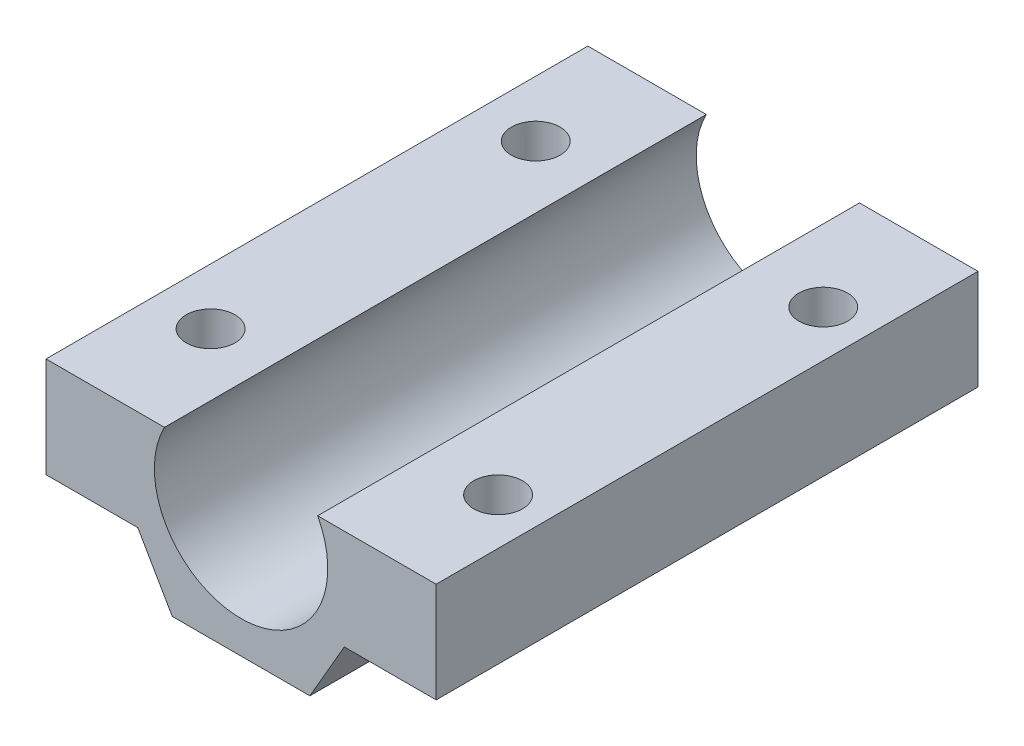
ISO-10303-21;
HEADER;
FILE_DESCRIPTION(('STEP AP214'),'2;1');
FILE_NAME('part.step','',(''),(''),'','','');
FILE_SCHEMA(('AUTOMOTIVE_DESIGN { 1 0 10303 214 1 1 1 1 }'));
ENDSEC;
DATA;
#1=APPLICATION_CONTEXT('core data for automotive mechanical design processes');
#2=APPLICATION_PROTOCOL_DEFINITION('international standard','automotive_design',2000,#1);
#3=PRODUCT_CONTEXT('',#1,'mechanical');
#4=PRODUCT('Part','Part','',(#3));
#5=PRODUCT_RELATED_PRODUCT_CATEGORY('part','',(#4));
#6=PRODUCT_DEFINITION_FORMATION('','',#4);
#7=PRODUCT_DEFINITION_CONTEXT('part definition',#1,'design');
#8=PRODUCT_DEFINITION('design','',#6,#7);
#9=PRODUCT_DEFINITION_SHAPE('','',#8);
#10=(LENGTH_UNIT() NAMED_UNIT(*) SI_UNIT(.MILLI.,.METRE.));
#11=(NAMED_UNIT(*) PLANE_ANGLE_UNIT() SI_UNIT($,.RADIAN.));
#12=(NAMED_UNIT(*) SI_UNIT($,.STERADIAN.) SOLID_ANGLE_UNIT());
#13=UNCERTAINTY_MEASURE_WITH_UNIT(LENGTH_MEASURE(1.E-05),#10,'distance_accuracy_value','');
#14=(GEOMETRIC_REPRESENTATION_CONTEXT(3) GLOBAL_UNCERTAINTY_ASSIGNED_CONTEXT((#13)) GLOBAL_UNIT_ASSIGNED_CONTEXT((#10,
#11,#12)) REPRESENTATION_CONTEXT('',''));
#15=CARTESIAN_POINT('',(0.,0.,0.));
#16=DIRECTION('',(0.,0.,1.));
#17=DIRECTION('',(1.,0.,0.));
#18=AXIS2_PLACEMENT_3D('',#15,#16,#17);
#19=CARTESIAN_POINT('',(0.,0.,50.));
#20=DIRECTION('',(0.,0.,1.));
#21=DIRECTION('',(1.,0.,0.));
#22=AXIS2_PLACEMENT_3D('',#19,#20,#21);
#23=PLANE('',#22);
#24=DIRECTION('',(0.,1.,0.));
#25=VECTOR('',#24,1.);
#26=CARTESIAN_POINT('',(18.,18.,50.));
#27=LINE('',#26,#25);
#28=CARTESIAN_POINT('',(18.,-5.5,50.));
#29=VERTEX_POINT('',#28);
#30=CARTESIAN_POINT('',(18.,3.75,50.));
#31=VERTEX_POINT('',#30);
#32=EDGE_CURVE('E134',#29,#31,#27,.T.);
#33=ORIENTED_EDGE('',*,*,#32,.T.);
#34=DIRECTION('',(1.,0.,0.));
#35=VECTOR('',#34,1.);
#36=CARTESIAN_POINT('',(-18.,3.75,50.));
#37=LINE('',#36,#35);
#38=CARTESIAN_POINT('',(7.06664701255128,3.75,50.));
#39=VERTEX_POINT('',#38);
#40=EDGE_CURVE('E117',#39,#31,#37,.T.);
#41=ORIENTED_EDGE('',*,*,#40,.F.);
#42=CARTESIAN_POINT('',(0.,0.,50.));
#43=DIRECTION('',(0.,0.,1.));
#44=DIRECTION('',(1.,0.,0.));
#45=AXIS2_PLACEMENT_3D('',#42,#43,#44);
#46=CIRCLE('',#45,8.);
#47=CARTESIAN_POINT('',(-7.06664701255129,3.75,50.));
#48=VERTEX_POINT('',#47);
#49=EDGE_CURVE('E127',#48,#39,#46,.T.);
#50=ORIENTED_EDGE('',*,*,#49,.F.);
#51=CARTESIAN_POINT('',(-18.,3.75,50.));
#52=VERTEX_POINT('',#51);
#53=EDGE_CURVE('E58',#52,#48,#37,.T.);
#54=ORIENTED_EDGE('',*,*,#53,.F.);
#55=DIRECTION('',(0.,-1.,0.));
#56=VECTOR('',#55,1.);
#57=CARTESIAN_POINT('',(-18.,18.,50.));
#58=LINE('',#57,#56);
#59=CARTESIAN_POINT('',(-18.,-5.5,50.));
#60=VERTEX_POINT('',#59);
#61=EDGE_CURVE('E123',#52,#60,#58,.T.);
#62=ORIENTED_EDGE('',*,*,#61,.T.);
#63=DIRECTION('',(-1.,0.,0.));
#64=VECTOR('',#63,1.);
#65=CARTESIAN_POINT('',(0.,-5.5,50.));
#66=LINE('',#65,#64);
#67=CARTESIAN_POINT('',(-9.52627944162882,-5.5,50.));
#68=VERTEX_POINT('',#67);
#69=EDGE_CURVE('E151',#68,#60,#66,.T.);
#70=ORIENTED_EDGE('',*,*,#69,.F.);
#71=DIRECTION('',(0.5,-0.866025403784439,0.));
#72=VECTOR('',#71,1.);
#73=CARTESIAN_POINT('',(-9.52627944162882,-5.5,50.));
#74=LINE('',#73,#72);
#75=CARTESIAN_POINT('',(-6.35085296108588,-11.,50.));
#76=VERTEX_POINT('',#75);
#77=EDGE_CURVE('E176',#68,#76,#74,.T.);
#78=ORIENTED_EDGE('',*,*,#77,.T.);
#79=DIRECTION('',(1.,0.,0.));
#80=VECTOR('',#79,1.);
#81=CARTESIAN_POINT('',(0.,-11.,50.));
#82=LINE('',#81,#80);
#83=CARTESIAN_POINT('',(6.35085296108588,-11.,50.));
#84=VERTEX_POINT('',#83);
#85=EDGE_CURVE('E173',#76,#84,#82,.T.);
#86=ORIENTED_EDGE('',*,*,#85,.T.);
#87=DIRECTION('',(0.5,0.866025403784439,0.));
#88=VECTOR('',#87,1.);
#89=CARTESIAN_POINT('',(9.52627944162882,-5.49999999999999,50.));
#90=LINE('',#89,#88);
#91=CARTESIAN_POINT('',(9.52627944162882,-5.5,50.));
#92=VERTEX_POINT('',#91);
#93=EDGE_CURVE('E169',#84,#92,#90,.T.);
#94=ORIENTED_EDGE('',*,*,#93,.T.);
#95=DIRECTION('',(-1.,0.,0.));
#96=VECTOR('',#95,1.);
#97=CARTESIAN_POINT('',(0.,-5.5,50.));
#98=LINE('',#97,#96);
#99=EDGE_CURVE('E166',#29,#92,#98,.T.);
#100=ORIENTED_EDGE('',*,*,#99,.F.);
#101=EDGE_LOOP('',(#33,#41,#50,#54,#62,#70,#78,#86,#94,#100));
#102=FACE_BOUND('',#101,.T.);
#103=ADVANCED_FACE('F33',(#102),#23,.T.);
#104=CARTESIAN_POINT('',(0.,0.,0.));
#105=DIRECTION('',(0.,0.,1.));
#106=DIRECTION('',(1.,0.,0.));
#107=AXIS2_PLACEMENT_3D('',#104,#105,#106);
#108=PLANE('',#107);
#109=DIRECTION('',(-1.,0.,0.));
#110=VECTOR('',#109,1.);
#111=CARTESIAN_POINT('',(0.,3.75,0.));
#112=LINE('',#111,#110);
#113=CARTESIAN_POINT('',(18.,3.75,0.));
#114=VERTEX_POINT('',#113);
#115=CARTESIAN_POINT('',(7.06664701255128,3.75,0.));
#116=VERTEX_POINT('',#115);
#117=EDGE_CURVE('E50',#114,#116,#112,.T.);
#118=ORIENTED_EDGE('',*,*,#117,.F.);
#119=DIRECTION('',(0.,1.,0.));
#120=VECTOR('',#119,1.);
#121=CARTESIAN_POINT('',(18.,18.,0.));
#122=LINE('',#121,#120);
#123=CARTESIAN_POINT('',(18.,-5.5,0.));
#124=VERTEX_POINT('',#123);
#125=EDGE_CURVE('E142',#124,#114,#122,.T.);
#126=ORIENTED_EDGE('',*,*,#125,.F.);
#127=DIRECTION('',(-1.,0.,0.));
#128=VECTOR('',#127,1.);
#129=CARTESIAN_POINT('',(0.,-5.5,0.));
#130=LINE('',#129,#128);
#131=CARTESIAN_POINT('',(9.52627944162882,-5.5,0.));
#132=VERTEX_POINT('',#131);
#133=EDGE_CURVE('E179',#124,#132,#130,.T.);
#134=ORIENTED_EDGE('',*,*,#133,.T.);
#135=DIRECTION('',(0.5,0.866025403784439,0.));
#136=VECTOR('',#135,1.);
#137=CARTESIAN_POINT('',(9.52627944162882,-5.49999999999999,0.));
#138=LINE('',#137,#136);
#139=CARTESIAN_POINT('',(6.35085296108588,-11.,0.));
#140=VERTEX_POINT('',#139);
#141=EDGE_CURVE('E211',#140,#132,#138,.T.);
#142=ORIENTED_EDGE('',*,*,#141,.F.);
#143=DIRECTION('',(1.,0.,0.));
#144=VECTOR('',#143,1.);
#145=CARTESIAN_POINT('',(0.,-11.,0.));
#146=LINE('',#145,#144);
#147=CARTESIAN_POINT('',(-6.35085296108588,-11.,0.));
#148=VERTEX_POINT('',#147);
#149=EDGE_CURVE('E162',#148,#140,#146,.T.);
#150=ORIENTED_EDGE('',*,*,#149,.F.);
#151=DIRECTION('',(0.5,-0.866025403784439,0.));
#152=VECTOR('',#151,1.);
#153=CARTESIAN_POINT('',(-9.52627944162882,-5.5,0.));
#154=LINE('',#153,#152);
#155=CARTESIAN_POINT('',(-9.52627944162882,-5.5,0.));
#156=VERTEX_POINT('',#155);
#157=EDGE_CURVE('E157',#156,#148,#154,.T.);
#158=ORIENTED_EDGE('',*,*,#157,.F.);
#159=DIRECTION('',(-1.,0.,0.));
#160=VECTOR('',#159,1.);
#161=CARTESIAN_POINT('',(0.,-5.5,0.));
#162=LINE('',#161,#160);
#163=CARTESIAN_POINT('',(-18.,-5.5,0.));
#164=VERTEX_POINT('',#163);
#165=EDGE_CURVE('E149',#156,#164,#162,.T.);
#166=ORIENTED_EDGE('',*,*,#165,.T.);
#167=DIRECTION('',(0.,-1.,0.));
#168=VECTOR('',#167,1.);
#169=CARTESIAN_POINT('',(-18.,18.,0.));
#170=LINE('',#169,#168);
#171=CARTESIAN_POINT('',(-18.,3.75,0.));
#172=VERTEX_POINT('',#171);
#173=EDGE_CURVE('E138',#172,#164,#170,.T.);
#174=ORIENTED_EDGE('',*,*,#173,.F.);
#175=CARTESIAN_POINT('',(-7.06664701255129,3.75,0.));
#176=VERTEX_POINT('',#175);
#177=EDGE_CURVE('E113',#176,#172,#112,.T.);
#178=ORIENTED_EDGE('',*,*,#177,.F.);
#179=CARTESIAN_POINT('',(0.,0.,0.));
#180=DIRECTION('',(0.,0.,1.));
#181=DIRECTION('',(1.,0.,0.));
#182=AXIS2_PLACEMENT_3D('',#179,#180,#181);
#183=CIRCLE('',#182,8.);
#184=EDGE_CURVE('E152',#176,#116,#183,.T.);
#185=ORIENTED_EDGE('',*,*,#184,.T.);
#186=EDGE_LOOP('',(#118,#126,#134,#142,#150,#158,#166,#174,#178,#185));
#187=FACE_BOUND('',#186,.T.);
#188=ADVANCED_FACE('F155',(#187),#108,.F.);
#189=CARTESIAN_POINT('',(18.,18.,50.));
#190=DIRECTION('',(-1.,0.,0.));
#191=DIRECTION('',(0.,-1.,0.));
#192=AXIS2_PLACEMENT_3D('',#189,#190,#191);
#193=PLANE('',#192);
#194=DIRECTION('',(0.,0.,-1.));
#195=VECTOR('',#194,1.);
#196=CARTESIAN_POINT('',(18.,3.75,50.));
#197=LINE('',#196,#195);
#198=EDGE_CURVE('E128',#31,#114,#197,.T.);
#199=ORIENTED_EDGE('',*,*,#198,.F.);
#200=ORIENTED_EDGE('',*,*,#32,.F.);
#201=DIRECTION('',(0.,0.,1.));
#202=VECTOR('',#201,1.);
#203=CARTESIAN_POINT('',(18.,-5.5,0.));
#204=LINE('',#203,#202);
#205=EDGE_CURVE('E158',#124,#29,#204,.T.);
#206=ORIENTED_EDGE('',*,*,#205,.F.);
#207=ORIENTED_EDGE('',*,*,#125,.T.);
#208=EDGE_LOOP('',(#199,#200,#206,#207));
#209=FACE_BOUND('',#208,.T.);
#210=ADVANCED_FACE('F35',(#209),#193,.F.);
#211=CARTESIAN_POINT('',(-18.,18.,50.));
#212=DIRECTION('',(1.,0.,0.));
#213=DIRECTION('',(0.,1.,0.));
#214=AXIS2_PLACEMENT_3D('',#211,#212,#213);
#215=PLANE('',#214);
#216=DIRECTION('',(0.,0.,-1.));
#217=VECTOR('',#216,1.);
#218=CARTESIAN_POINT('',(-18.,3.75,50.));
#219=LINE('',#218,#217);
#220=EDGE_CURVE('E110',#52,#172,#219,.T.);
#221=ORIENTED_EDGE('',*,*,#220,.T.);
#222=ORIENTED_EDGE('',*,*,#173,.T.);
#223=DIRECTION('',(0.,0.,1.));
#224=VECTOR('',#223,1.);
#225=CARTESIAN_POINT('',(-18.,-5.5,0.));
#226=LINE('',#225,#224);
#227=EDGE_CURVE('E133',#164,#60,#226,.T.);
#228=ORIENTED_EDGE('',*,*,#227,.T.);
#229=ORIENTED_EDGE('',*,*,#61,.F.);
#230=EDGE_LOOP('',(#221,#222,#228,#229));
#231=FACE_BOUND('',#230,.T.);
#232=ADVANCED_FACE('F131',(#231),#215,.F.);
#233=CARTESIAN_POINT('',(0.,0.,50.));
#234=DIRECTION('',(0.,0.,-1.));
#235=DIRECTION('',(-1.,0.,0.));
#236=AXIS2_PLACEMENT_3D('',#233,#234,#235);
#237=CYLINDRICAL_SURFACE('',#236,8.);
#238=ORIENTED_EDGE('',*,*,#49,.T.);
#239=DIRECTION('',(0.,0.,-1.));
#240=VECTOR('',#239,1.);
#241=CARTESIAN_POINT('',(7.06664701255128,3.75,50.));
#242=LINE('',#241,#240);
#243=EDGE_CURVE('E193',#39,#116,#242,.T.);
#244=ORIENTED_EDGE('',*,*,#243,.T.);
#245=ORIENTED_EDGE('',*,*,#184,.F.);
#246=DIRECTION('',(0.,0.,-1.));
#247=VECTOR('',#246,1.);
#248=CARTESIAN_POINT('',(-7.06664701255129,3.75,50.));
#249=LINE('',#248,#247);
#250=EDGE_CURVE('E192',#176,#48,#249,.F.);
#251=ORIENTED_EDGE('',*,*,#250,.T.);
#252=EDGE_LOOP('',(#238,#244,#245,#251));
#253=FACE_BOUND('',#252,.T.);
#254=ADVANCED_FACE('F191',(#253),#237,.F.);
#255=CARTESIAN_POINT('',(-12.8104985211385,-5.49999999999999,40.));
#256=DIRECTION('',(0.,-1.,0.));
#257=DIRECTION('',(0.,0.,-1.));
#258=AXIS2_PLACEMENT_3D('',#255,#256,#257);
#259=CYLINDRICAL_SURFACE('',#258,2.24999999999999);
#260=CARTESIAN_POINT('',(-12.8104985211385,-5.49999999999999,40.));
#261=DIRECTION('',(0.,-1.,0.));
#262=DIRECTION('',(0.,0.,-1.));
#263=AXIS2_PLACEMENT_3D('',#260,#261,#262);
#264=CIRCLE('',#263,2.24999999999999);
#265=CARTESIAN_POINT('',(-12.8104985211385,-5.49999999999999,37.75));
#266=VERTEX_POINT('',#265);
#267=EDGE_CURVE('E170',#266,#266,#264,.T.);
#268=ORIENTED_EDGE('',*,*,#267,.T.);
#269=EDGE_LOOP('',(#268));
#270=FACE_BOUND('',#269,.T.);
#271=CARTESIAN_POINT('',(-12.8104985211385,3.75,40.));
#272=DIRECTION('',(0.,1.,0.));
#273=DIRECTION('',(0.,0.,1.));
#274=AXIS2_PLACEMENT_3D('',#271,#272,#273);
#275=CIRCLE('',#274,2.24999999999999);
#276=CARTESIAN_POINT('',(-12.8104985211385,3.75,42.25));
#277=VERTEX_POINT('',#276);
#278=EDGE_CURVE('E11',#277,#277,#275,.F.);
#279=ORIENTED_EDGE('',*,*,#278,.F.);
#280=EDGE_LOOP('',(#279));
#281=FACE_BOUND('',#280,.T.);
#282=ADVANCED_FACE('F255',(#270,#281),#259,.F.);
#283=CARTESIAN_POINT('',(-12.8104985211385,-5.49999999999999,10.));
#284=DIRECTION('',(0.,-1.,0.));
#285=DIRECTION('',(0.,0.,-1.));
#286=AXIS2_PLACEMENT_3D('',#283,#284,#285);
#287=CYLINDRICAL_SURFACE('',#286,2.24999999999999);
#288=CARTESIAN_POINT('',(-12.8104985211385,-5.49999999999999,10.));
#289=DIRECTION('',(0.,-1.,0.));
#290=DIRECTION('',(0.,0.,-1.));
#291=AXIS2_PLACEMENT_3D('',#288,#289,#290);
#292=CIRCLE('',#291,2.24999999999999);
#293=CARTESIAN_POINT('',(-12.8104985211385,-5.49999999999999,7.75000000000001));
#294=VERTEX_POINT('',#293);
#295=EDGE_CURVE('E204',#294,#294,#292,.T.);
#296=ORIENTED_EDGE('',*,*,#295,.T.);
#297=EDGE_LOOP('',(#296));
#298=FACE_BOUND('',#297,.T.);
#299=CARTESIAN_POINT('',(-12.8104985211385,3.75,10.));
#300=DIRECTION('',(0.,1.,0.));
#301=DIRECTION('',(0.,0.,1.));
#302=AXIS2_PLACEMENT_3D('',#299,#300,#301);
#303=CIRCLE('',#302,2.24999999999999);
#304=CARTESIAN_POINT('',(-12.8104985211385,3.75,12.25));
#305=VERTEX_POINT('',#304);
#306=EDGE_CURVE('E42',#305,#305,#303,.F.);
#307=ORIENTED_EDGE('',*,*,#306,.F.);
#308=EDGE_LOOP('',(#307));
#309=FACE_BOUND('',#308,.T.);
#310=ADVANCED_FACE('F318',(#298,#309),#287,.F.);
#311=CARTESIAN_POINT('',(13.7183291249987,-5.5,10.));
#312=DIRECTION('',(0.,-1.,0.));
#313=DIRECTION('',(0.,0.,-1.));
#314=AXIS2_PLACEMENT_3D('',#311,#312,#313);
#315=CYLINDRICAL_SURFACE('',#314,2.24999999999999);
#316=CARTESIAN_POINT('',(13.7183291249987,-5.5,10.));
#317=DIRECTION('',(0.,-1.,0.));
#318=DIRECTION('',(0.,0.,-1.));
#319=AXIS2_PLACEMENT_3D('',#316,#317,#318);
#320=CIRCLE('',#319,2.24999999999999);
#321=CARTESIAN_POINT('',(13.7183291249987,-5.5,7.75000000000001));
#322=VERTEX_POINT('',#321);
#323=EDGE_CURVE('E201',#322,#322,#320,.T.);
#324=ORIENTED_EDGE('',*,*,#323,.T.);
#325=EDGE_LOOP('',(#324));
#326=FACE_BOUND('',#325,.T.);
#327=CARTESIAN_POINT('',(13.7183291249987,3.75,10.));
#328=DIRECTION('',(0.,1.,0.));
#329=DIRECTION('',(0.,0.,1.));
#330=AXIS2_PLACEMENT_3D('',#327,#328,#329);
#331=CIRCLE('',#330,2.24999999999999);
#332=CARTESIAN_POINT('',(13.7183291249987,3.75,12.25));
#333=VERTEX_POINT('',#332);
#334=EDGE_CURVE('E137',#333,#333,#331,.F.);
#335=ORIENTED_EDGE('',*,*,#334,.F.);
#336=EDGE_LOOP('',(#335));
#337=FACE_BOUND('',#336,.T.);
#338=ADVANCED_FACE('F310',(#326,#337),#315,.F.);
#339=CARTESIAN_POINT('',(13.7183291249987,-5.5,40.));
#340=DIRECTION('',(0.,-1.,0.));
#341=DIRECTION('',(0.,0.,-1.));
#342=AXIS2_PLACEMENT_3D('',#339,#340,#341);
#343=CYLINDRICAL_SURFACE('',#342,2.24999999999999);
#344=CARTESIAN_POINT('',(13.7183291249987,-5.5,40.));
#345=DIRECTION('',(0.,-1.,0.));
#346=DIRECTION('',(0.,0.,-1.));
#347=AXIS2_PLACEMENT_3D('',#344,#345,#346);
#348=CIRCLE('',#347,2.24999999999999);
#349=CARTESIAN_POINT('',(13.7183291249987,-5.5,37.75));
#350=VERTEX_POINT('',#349);
#351=EDGE_CURVE('E195',#350,#350,#348,.T.);
#352=ORIENTED_EDGE('',*,*,#351,.T.);
#353=EDGE_LOOP('',(#352));
#354=FACE_BOUND('',#353,.T.);
#355=CARTESIAN_POINT('',(13.7183291249987,3.75,40.));
#356=DIRECTION('',(0.,1.,0.));
#357=DIRECTION('',(0.,0.,1.));
#358=AXIS2_PLACEMENT_3D('',#355,#356,#357);
#359=CIRCLE('',#358,2.24999999999999);
#360=CARTESIAN_POINT('',(13.7183291249987,3.75,42.25));
#361=VERTEX_POINT('',#360);
#362=EDGE_CURVE('E37',#361,#361,#359,.F.);
#363=ORIENTED_EDGE('',*,*,#362,.F.);
#364=EDGE_LOOP('',(#363));
#365=FACE_BOUND('',#364,.T.);
#366=ADVANCED_FACE('F239',(#354,#365),#343,.F.);
#367=CARTESIAN_POINT('',(0.,-5.5,0.));
#368=DIRECTION('',(0.,1.,0.));
#369=DIRECTION('',(-1.,0.,0.));
#370=AXIS2_PLACEMENT_3D('',#367,#368,#369);
#371=PLANE('',#370);
#372=ORIENTED_EDGE('',*,*,#295,.F.);
#373=EDGE_LOOP('',(#372));
#374=FACE_BOUND('',#373,.T.);
#375=ORIENTED_EDGE('',*,*,#267,.F.);
#376=EDGE_LOOP('',(#375));
#377=FACE_BOUND('',#376,.T.);
#378=ORIENTED_EDGE('',*,*,#69,.T.);
#379=ORIENTED_EDGE('',*,*,#227,.F.);
#380=ORIENTED_EDGE('',*,*,#165,.F.);
#381=DIRECTION('',(0.,0.,1.));
#382=VECTOR('',#381,1.);
#383=CARTESIAN_POINT('',(-9.52627944162882,-5.5,0.));
#384=LINE('',#383,#382);
#385=EDGE_CURVE('E153',#156,#68,#384,.T.);
#386=ORIENTED_EDGE('',*,*,#385,.T.);
#387=EDGE_LOOP('',(#378,#379,#380,#386));
#388=FACE_BOUND('',#387,.T.);
#389=ADVANCED_FACE('F148',(#374,#377,#388),#371,.F.);
#390=CARTESIAN_POINT('',(-9.52627944162882,-5.5,0.));
#391=DIRECTION('',(-0.866025403784439,-0.5,0.));
#392=DIRECTION('',(0.5,-0.866025403784439,0.));
#393=AXIS2_PLACEMENT_3D('',#390,#391,#392);
#394=PLANE('',#393);
#395=ORIENTED_EDGE('',*,*,#77,.F.);
#396=ORIENTED_EDGE('',*,*,#385,.F.);
#397=ORIENTED_EDGE('',*,*,#157,.T.);
#398=DIRECTION('',(0.,0.,1.));
#399=VECTOR('',#398,1.);
#400=CARTESIAN_POINT('',(-6.35085296108588,-11.,0.));
#401=LINE('',#400,#399);
#402=EDGE_CURVE('E182',#148,#76,#401,.T.);
#403=ORIENTED_EDGE('',*,*,#402,.T.);
#404=EDGE_LOOP('',(#395,#396,#397,#403));
#405=FACE_BOUND('',#404,.T.);
#406=ADVANCED_FACE('F231',(#405),#394,.T.);
#407=CARTESIAN_POINT('',(0.,-11.,0.));
#408=DIRECTION('',(0.,-1.,0.));
#409=DIRECTION('',(1.,0.,0.));
#410=AXIS2_PLACEMENT_3D('',#407,#408,#409);
#411=PLANE('',#410);
#412=ORIENTED_EDGE('',*,*,#85,.F.);
#413=ORIENTED_EDGE('',*,*,#402,.F.);
#414=ORIENTED_EDGE('',*,*,#149,.T.);
#415=DIRECTION('',(0.,0.,1.));
#416=VECTOR('',#415,1.);
#417=CARTESIAN_POINT('',(6.35085296108588,-11.,0.));
#418=LINE('',#417,#416);
#419=EDGE_CURVE('E184',#140,#84,#418,.T.);
#420=ORIENTED_EDGE('',*,*,#419,.T.);
#421=EDGE_LOOP('',(#412,#413,#414,#420));
#422=FACE_BOUND('',#421,.T.);
#423=ADVANCED_FACE('F216',(#422),#411,.T.);
#424=CARTESIAN_POINT('',(9.52627944162882,-5.49999999999999,0.));
#425=DIRECTION('',(0.866025403784439,-0.5,0.));
#426=DIRECTION('',(0.5,0.866025403784439,0.));
#427=AXIS2_PLACEMENT_3D('',#424,#425,#426);
#428=PLANE('',#427);
#429=ORIENTED_EDGE('',*,*,#93,.F.);
#430=ORIENTED_EDGE('',*,*,#419,.F.);
#431=ORIENTED_EDGE('',*,*,#141,.T.);
#432=DIRECTION('',(0.,0.,1.));
#433=VECTOR('',#432,1.);
#434=CARTESIAN_POINT('',(9.52627944162882,-5.5,0.));
#435=LINE('',#434,#433);
#436=EDGE_CURVE('E160',#132,#92,#435,.T.);
#437=ORIENTED_EDGE('',*,*,#436,.T.);
#438=EDGE_LOOP('',(#429,#430,#431,#437));
#439=FACE_BOUND('',#438,.T.);
#440=ADVANCED_FACE('F220',(#439),#428,.T.);
#441=CARTESIAN_POINT('',(0.,-5.5,0.));
#442=DIRECTION('',(0.,1.,0.));
#443=DIRECTION('',(-1.,0.,0.));
#444=AXIS2_PLACEMENT_3D('',#441,#442,#443);
#445=PLANE('',#444);
#446=ORIENTED_EDGE('',*,*,#351,.F.);
#447=EDGE_LOOP('',(#446));
#448=FACE_BOUND('',#447,.T.);
#449=ORIENTED_EDGE('',*,*,#323,.F.);
#450=EDGE_LOOP('',(#449));
#451=FACE_BOUND('',#450,.T.);
#452=ORIENTED_EDGE('',*,*,#99,.T.);
#453=ORIENTED_EDGE('',*,*,#436,.F.);
#454=ORIENTED_EDGE('',*,*,#133,.F.);
#455=ORIENTED_EDGE('',*,*,#205,.T.);
#456=EDGE_LOOP('',(#452,#453,#454,#455));
#457=FACE_BOUND('',#456,.T.);
#458=ADVANCED_FACE('F224',(#448,#451,#457),#445,.F.);
#459=CARTESIAN_POINT('',(-18.,3.75,50.));
#460=DIRECTION('',(0.,1.,0.));
#461=DIRECTION('',(0.,0.,1.));
#462=AXIS2_PLACEMENT_3D('',#459,#460,#461);
#463=PLANE('',#462);
#464=ORIENTED_EDGE('',*,*,#334,.T.);
#465=EDGE_LOOP('',(#464));
#466=FACE_BOUND('',#465,.T.);
#467=ORIENTED_EDGE('',*,*,#362,.T.);
#468=EDGE_LOOP('',(#467));
#469=FACE_BOUND('',#468,.T.);
#470=ORIENTED_EDGE('',*,*,#198,.T.);
#471=ORIENTED_EDGE('',*,*,#117,.T.);
#472=ORIENTED_EDGE('',*,*,#243,.F.);
#473=ORIENTED_EDGE('',*,*,#40,.T.);
#474=EDGE_LOOP('',(#470,#471,#472,#473));
#475=FACE_BOUND('',#474,.T.);
#476=ADVANCED_FACE('F276',(#466,#469,#475),#463,.T.);
#477=ORIENTED_EDGE('',*,*,#278,.T.);
#478=EDGE_LOOP('',(#477));
#479=FACE_BOUND('',#478,.T.);
#480=ORIENTED_EDGE('',*,*,#306,.T.);
#481=EDGE_LOOP('',(#480));
#482=FACE_BOUND('',#481,.T.);
#483=ORIENTED_EDGE('',*,*,#250,.F.);
#484=ORIENTED_EDGE('',*,*,#177,.T.);
#485=ORIENTED_EDGE('',*,*,#220,.F.);
#486=ORIENTED_EDGE('',*,*,#53,.T.);
#487=EDGE_LOOP('',(#483,#484,#485,#486));
#488=FACE_BOUND('',#487,.T.);
#489=ADVANCED_FACE('F111',(#479,#482,#488),#463,.T.);
#490=CLOSED_SHELL('',(#103,#188,#210,#232,#254,#282,#310,#338,#366,#389,#406,#423,#440,#458,
#476,#489));
#491=MANIFOLD_SOLID_BREP('B2',#490);
#492=ADVANCED_BREP_SHAPE_REPRESENTATION('',(#18,#491),#14);
#493=SHAPE_DEFINITION_REPRESENTATION(#9,#492);
ENDSEC;
END-ISO-10303-21;
